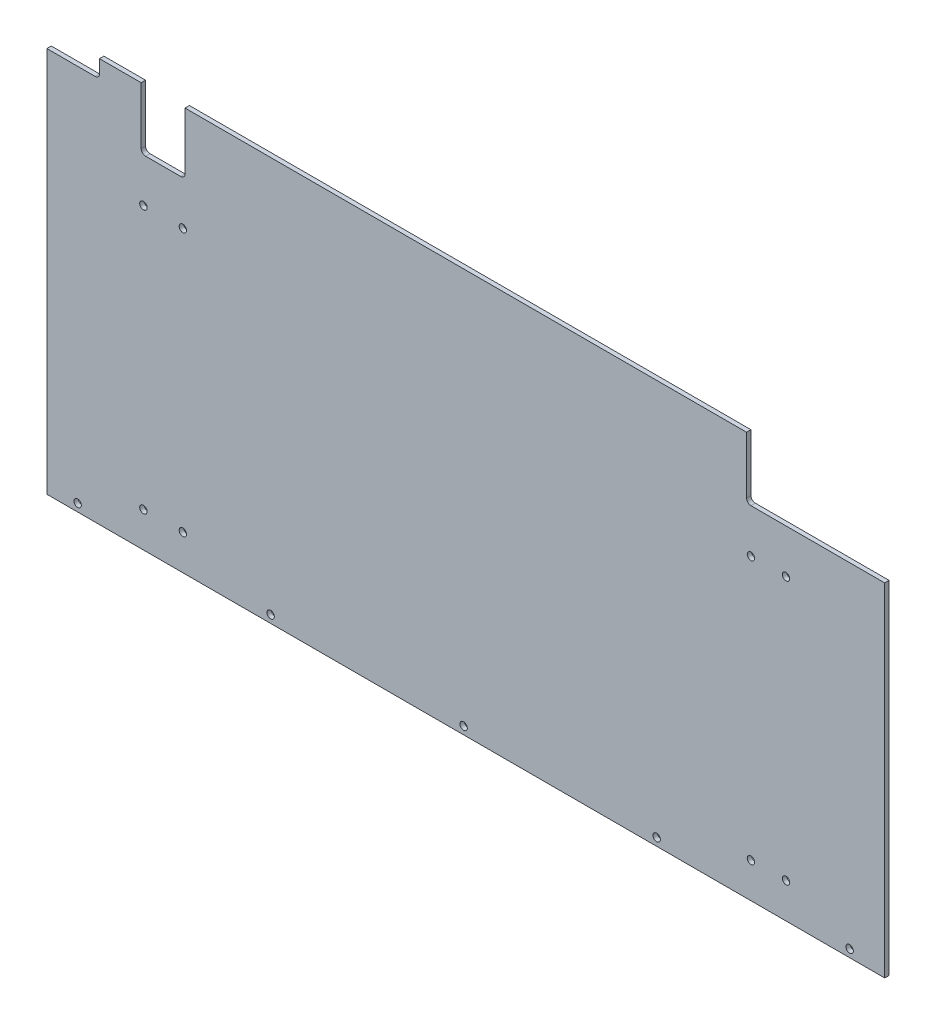
ISO-10303-21;
HEADER;
FILE_DESCRIPTION(('STEP AP214'),'2;1');
FILE_NAME('part.step','',(''),(''),'','','');
FILE_SCHEMA(('AUTOMOTIVE_DESIGN { 1 0 10303 214 1 1 1 1 }'));
ENDSEC;
DATA;
#1=APPLICATION_CONTEXT('core data for automotive mechanical design processes');
#2=APPLICATION_PROTOCOL_DEFINITION('international standard','automotive_design',2000,#1);
#3=PRODUCT_CONTEXT('',#1,'mechanical');
#4=PRODUCT('Part','Part','',(#3));
#5=PRODUCT_RELATED_PRODUCT_CATEGORY('part','',(#4));
#6=PRODUCT_DEFINITION_FORMATION('','',#4);
#7=PRODUCT_DEFINITION_CONTEXT('part definition',#1,'design');
#8=PRODUCT_DEFINITION('design','',#6,#7);
#9=PRODUCT_DEFINITION_SHAPE('','',#8);
#10=(LENGTH_UNIT() NAMED_UNIT(*) SI_UNIT(.MILLI.,.METRE.));
#11=(NAMED_UNIT(*) PLANE_ANGLE_UNIT() SI_UNIT($,.RADIAN.));
#12=(NAMED_UNIT(*) SI_UNIT($,.STERADIAN.) SOLID_ANGLE_UNIT());
#13=UNCERTAINTY_MEASURE_WITH_UNIT(LENGTH_MEASURE(1.E-05),#10,'distance_accuracy_value','');
#14=(GEOMETRIC_REPRESENTATION_CONTEXT(3) GLOBAL_UNCERTAINTY_ASSIGNED_CONTEXT((#13)) GLOBAL_UNIT_ASSIGNED_CONTEXT((#10,
#11,#12)) REPRESENTATION_CONTEXT('',''));
#15=CARTESIAN_POINT('',(0.,0.,0.));
#16=DIRECTION('',(0.,0.,1.));
#17=DIRECTION('',(1.,0.,0.));
#18=AXIS2_PLACEMENT_3D('',#15,#16,#17);
#19=CARTESIAN_POINT('',(-606.425,292.1,3.175));
#20=DIRECTION('',(0.,-1.,0.));
#21=DIRECTION('',(0.,0.,-1.));
#22=AXIS2_PLACEMENT_3D('',#19,#20,#21);
#23=PLANE('',#22);
#24=DIRECTION('',(0.,0.,1.));
#25=VECTOR('',#24,1.);
#26=CARTESIAN_POINT('',(-530.225,292.1,-3.175));
#27=LINE('',#26,#25);
#28=CARTESIAN_POINT('',(-530.225,292.1,-3.175));
#29=VERTEX_POINT('',#28);
#30=CARTESIAN_POINT('',(-530.225,292.1,3.175));
#31=VERTEX_POINT('',#30);
#32=EDGE_CURVE('E180',#29,#31,#27,.T.);
#33=ORIENTED_EDGE('',*,*,#32,.T.);
#34=DIRECTION('',(-1.,0.,0.));
#35=VECTOR('',#34,1.);
#36=CARTESIAN_POINT('',(-606.425,292.1,3.175));
#37=LINE('',#36,#35);
#38=CARTESIAN_POINT('',(-469.9,292.1,3.175));
#39=VERTEX_POINT('',#38);
#40=EDGE_CURVE('E281',#39,#31,#37,.T.);
#41=ORIENTED_EDGE('',*,*,#40,.F.);
#42=DIRECTION('',(0.,0.,1.));
#43=VECTOR('',#42,1.);
#44=CARTESIAN_POINT('',(-469.9,292.1,-3.175));
#45=LINE('',#44,#43);
#46=CARTESIAN_POINT('',(-469.9,292.1,-3.175));
#47=VERTEX_POINT('',#46);
#48=EDGE_CURVE('E221',#47,#39,#45,.T.);
#49=ORIENTED_EDGE('',*,*,#48,.F.);
#50=DIRECTION('',(-1.,0.,0.));
#51=VECTOR('',#50,1.);
#52=CARTESIAN_POINT('',(-606.425,292.1,-3.175));
#53=LINE('',#52,#51);
#54=EDGE_CURVE('E293',#47,#29,#53,.T.);
#55=ORIENTED_EDGE('',*,*,#54,.T.);
#56=EDGE_LOOP('',(#33,#41,#49,#55));
#57=FACE_BOUND('',#56,.T.);
#58=ADVANCED_FACE('F33',(#57),#23,.F.);
#59=CARTESIAN_POINT('',(555.625,-280.9875,3.175));
#60=DIRECTION('',(0.,0.,1.));
#61=DIRECTION('',(1.,0.,0.));
#62=AXIS2_PLACEMENT_3D('',#59,#60,#61);
#63=CYLINDRICAL_SURFACE('',#62,5.35787600000004);
#64=CARTESIAN_POINT('',(555.625,-280.9875,-3.175));
#65=DIRECTION('',(0.,0.,1.));
#66=DIRECTION('',(1.,0.,0.));
#67=AXIS2_PLACEMENT_3D('',#64,#65,#66);
#68=CIRCLE('',#67,5.35787600000004);
#69=CARTESIAN_POINT('',(560.982876,-280.9875,-3.175));
#70=VERTEX_POINT('',#69);
#71=EDGE_CURVE('E41',#70,#70,#68,.T.);
#72=ORIENTED_EDGE('',*,*,#71,.F.);
#73=EDGE_LOOP('',(#72));
#74=FACE_BOUND('',#73,.T.);
#75=CARTESIAN_POINT('',(555.625,-280.9875,3.175));
#76=DIRECTION('',(0.,0.,1.));
#77=DIRECTION('',(1.,0.,0.));
#78=AXIS2_PLACEMENT_3D('',#75,#76,#77);
#79=CIRCLE('',#78,5.35787600000004);
#80=CARTESIAN_POINT('',(560.982876,-280.9875,3.175));
#81=VERTEX_POINT('',#80);
#82=EDGE_CURVE('E11',#81,#81,#79,.T.);
#83=ORIENTED_EDGE('',*,*,#82,.T.);
#84=EDGE_LOOP('',(#83));
#85=FACE_BOUND('',#84,.T.);
#86=ADVANCED_FACE('F35',(#74,#85),#63,.F.);
#87=CARTESIAN_POINT('',(276.225,-280.9875,3.175));
#88=DIRECTION('',(0.,0.,1.));
#89=DIRECTION('',(1.,0.,0.));
#90=AXIS2_PLACEMENT_3D('',#87,#88,#89);
#91=CYLINDRICAL_SURFACE('',#90,5.35787600000004);
#92=CARTESIAN_POINT('',(276.225,-280.9875,-3.175));
#93=DIRECTION('',(0.,0.,1.));
#94=DIRECTION('',(1.,0.,0.));
#95=AXIS2_PLACEMENT_3D('',#92,#93,#94);
#96=CIRCLE('',#95,5.35787600000004);
#97=CARTESIAN_POINT('',(281.582876,-280.9875,-3.175));
#98=VERTEX_POINT('',#97);
#99=EDGE_CURVE('E336',#98,#98,#96,.T.);
#100=ORIENTED_EDGE('',*,*,#99,.F.);
#101=EDGE_LOOP('',(#100));
#102=FACE_BOUND('',#101,.T.);
#103=CARTESIAN_POINT('',(276.225,-280.9875,3.175));
#104=DIRECTION('',(0.,0.,1.));
#105=DIRECTION('',(1.,0.,0.));
#106=AXIS2_PLACEMENT_3D('',#103,#104,#105);
#107=CIRCLE('',#106,5.35787600000004);
#108=CARTESIAN_POINT('',(281.582876,-280.9875,3.175));
#109=VERTEX_POINT('',#108);
#110=EDGE_CURVE('E339',#109,#109,#107,.T.);
#111=ORIENTED_EDGE('',*,*,#110,.T.);
#112=EDGE_LOOP('',(#111));
#113=FACE_BOUND('',#112,.T.);
#114=ADVANCED_FACE('F347',(#102,#113),#91,.F.);
#115=CARTESIAN_POINT('',(-3.17500000000015,-280.9875,3.175));
#116=DIRECTION('',(0.,0.,1.));
#117=DIRECTION('',(1.,0.,0.));
#118=AXIS2_PLACEMENT_3D('',#115,#116,#117);
#119=CYLINDRICAL_SURFACE('',#118,5.35787600000004);
#120=CARTESIAN_POINT('',(-3.17500000000015,-280.9875,-3.175));
#121=DIRECTION('',(0.,0.,1.));
#122=DIRECTION('',(1.,0.,0.));
#123=AXIS2_PLACEMENT_3D('',#120,#121,#122);
#124=CIRCLE('',#123,5.35787600000004);
#125=CARTESIAN_POINT('',(2.18287599999989,-280.9875,-3.175));
#126=VERTEX_POINT('',#125);
#127=EDGE_CURVE('E330',#126,#126,#124,.T.);
#128=ORIENTED_EDGE('',*,*,#127,.F.);
#129=EDGE_LOOP('',(#128));
#130=FACE_BOUND('',#129,.T.);
#131=CARTESIAN_POINT('',(-3.17500000000015,-280.9875,3.175));
#132=DIRECTION('',(0.,0.,1.));
#133=DIRECTION('',(1.,0.,0.));
#134=AXIS2_PLACEMENT_3D('',#131,#132,#133);
#135=CIRCLE('',#134,5.35787600000004);
#136=CARTESIAN_POINT('',(2.18287599999989,-280.9875,3.175));
#137=VERTEX_POINT('',#136);
#138=EDGE_CURVE('E333',#137,#137,#135,.T.);
#139=ORIENTED_EDGE('',*,*,#138,.T.);
#140=EDGE_LOOP('',(#139));
#141=FACE_BOUND('',#140,.T.);
#142=ADVANCED_FACE('F377',(#130,#141),#119,.F.);
#143=CARTESIAN_POINT('',(406.4,292.1,-3.175));
#144=VERTEX_POINT('',#143);
#145=CARTESIAN_POINT('',(-406.4,292.1,-3.175));
#146=VERTEX_POINT('',#145);
#147=EDGE_CURVE('E296',#144,#146,#53,.T.);
#148=ORIENTED_EDGE('',*,*,#147,.T.);
#149=DIRECTION('',(0.,0.,1.));
#150=VECTOR('',#149,1.);
#151=CARTESIAN_POINT('',(-406.4,292.1,-3.175));
#152=LINE('',#151,#150);
#153=CARTESIAN_POINT('',(-406.4,292.1,3.175));
#154=VERTEX_POINT('',#153);
#155=EDGE_CURVE('E212',#146,#154,#152,.T.);
#156=ORIENTED_EDGE('',*,*,#155,.T.);
#157=CARTESIAN_POINT('',(406.4,292.1,3.175));
#158=VERTEX_POINT('',#157);
#159=EDGE_CURVE('E285',#158,#154,#37,.T.);
#160=ORIENTED_EDGE('',*,*,#159,.F.);
#161=DIRECTION('',(0.,0.,1.));
#162=VECTOR('',#161,1.);
#163=CARTESIAN_POINT('',(406.4,292.1,-3.175));
#164=LINE('',#163,#162);
#165=EDGE_CURVE('E272',#144,#158,#164,.T.);
#166=ORIENTED_EDGE('',*,*,#165,.F.);
#167=EDGE_LOOP('',(#148,#156,#160,#166));
#168=FACE_BOUND('',#167,.T.);
#169=ADVANCED_FACE('F370',(#168),#23,.F.);
#170=CARTESIAN_POINT('',(606.425,292.1,3.175));
#171=DIRECTION('',(-1.,0.,0.));
#172=DIRECTION('',(0.,0.,1.));
#173=AXIS2_PLACEMENT_3D('',#170,#171,#172);
#174=PLANE('',#173);
#175=DIRECTION('',(0.,1.,0.));
#176=VECTOR('',#175,1.);
#177=CARTESIAN_POINT('',(606.425,292.1,-3.175));
#178=LINE('',#177,#176);
#179=CARTESIAN_POINT('',(606.425,-292.1,-3.175));
#180=VERTEX_POINT('',#179);
#181=CARTESIAN_POINT('',(606.425,203.2,-3.175));
#182=VERTEX_POINT('',#181);
#183=EDGE_CURVE('E277',#180,#182,#178,.T.);
#184=ORIENTED_EDGE('',*,*,#183,.T.);
#185=DIRECTION('',(0.,0.,1.));
#186=VECTOR('',#185,1.);
#187=CARTESIAN_POINT('',(606.425,203.2,-3.175));
#188=LINE('',#187,#186);
#189=CARTESIAN_POINT('',(606.425,203.2,3.175));
#190=VERTEX_POINT('',#189);
#191=EDGE_CURVE('E195',#182,#190,#188,.T.);
#192=ORIENTED_EDGE('',*,*,#191,.T.);
#193=DIRECTION('',(0.,1.,0.));
#194=VECTOR('',#193,1.);
#195=CARTESIAN_POINT('',(606.425,292.1,3.175));
#196=LINE('',#195,#194);
#197=CARTESIAN_POINT('',(606.425,-292.1,3.175));
#198=VERTEX_POINT('',#197);
#199=EDGE_CURVE('E278',#198,#190,#196,.T.);
#200=ORIENTED_EDGE('',*,*,#199,.F.);
#201=DIRECTION('',(0.,0.,-1.));
#202=VECTOR('',#201,1.);
#203=CARTESIAN_POINT('',(606.425,-292.1,3.175));
#204=LINE('',#203,#202);
#205=EDGE_CURVE('E290',#198,#180,#204,.T.);
#206=ORIENTED_EDGE('',*,*,#205,.T.);
#207=EDGE_LOOP('',(#184,#192,#200,#206));
#208=FACE_BOUND('',#207,.T.);
#209=ADVANCED_FACE('F376',(#208),#174,.F.);
#210=CARTESIAN_POINT('',(-606.425,292.1,3.175));
#211=DIRECTION('',(1.,0.,0.));
#212=DIRECTION('',(0.,1.,0.));
#213=AXIS2_PLACEMENT_3D('',#210,#211,#212);
#214=PLANE('',#213);
#215=DIRECTION('',(0.,-1.,0.));
#216=VECTOR('',#215,1.);
#217=CARTESIAN_POINT('',(-606.425,292.1,3.175));
#218=LINE('',#217,#216);
#219=CARTESIAN_POINT('',(-606.425,266.7,3.175));
#220=VERTEX_POINT('',#219);
#221=CARTESIAN_POINT('',(-606.425,-292.1,3.175));
#222=VERTEX_POINT('',#221);
#223=EDGE_CURVE('E286',#220,#222,#218,.T.);
#224=ORIENTED_EDGE('',*,*,#223,.F.);
#225=DIRECTION('',(0.,0.,1.));
#226=VECTOR('',#225,1.);
#227=CARTESIAN_POINT('',(-606.425,266.7,-3.175));
#228=LINE('',#227,#226);
#229=CARTESIAN_POINT('',(-606.425,266.7,-3.175));
#230=VERTEX_POINT('',#229);
#231=EDGE_CURVE('E177',#230,#220,#228,.T.);
#232=ORIENTED_EDGE('',*,*,#231,.F.);
#233=DIRECTION('',(0.,-1.,0.));
#234=VECTOR('',#233,1.);
#235=CARTESIAN_POINT('',(-606.425,292.1,-3.175));
#236=LINE('',#235,#234);
#237=CARTESIAN_POINT('',(-606.425,-292.1,-3.175));
#238=VERTEX_POINT('',#237);
#239=EDGE_CURVE('E167',#230,#238,#236,.T.);
#240=ORIENTED_EDGE('',*,*,#239,.T.);
#241=DIRECTION('',(0.,0.,-1.));
#242=VECTOR('',#241,1.);
#243=CARTESIAN_POINT('',(-606.425,-292.1,3.175));
#244=LINE('',#243,#242);
#245=EDGE_CURVE('E301',#222,#238,#244,.T.);
#246=ORIENTED_EDGE('',*,*,#245,.F.);
#247=EDGE_LOOP('',(#224,#232,#240,#246));
#248=FACE_BOUND('',#247,.T.);
#249=ADVANCED_FACE('F362',(#248),#214,.F.);
#250=CARTESIAN_POINT('',(-606.425,-292.1,3.175));
#251=DIRECTION('',(0.,1.,0.));
#252=DIRECTION('',(0.,0.,1.));
#253=AXIS2_PLACEMENT_3D('',#250,#251,#252);
#254=PLANE('',#253);
#255=DIRECTION('',(1.,0.,0.));
#256=VECTOR('',#255,1.);
#257=CARTESIAN_POINT('',(-606.425,-292.1,-3.175));
#258=LINE('',#257,#256);
#259=EDGE_CURVE('E282',#238,#180,#258,.T.);
#260=ORIENTED_EDGE('',*,*,#259,.T.);
#261=ORIENTED_EDGE('',*,*,#205,.F.);
#262=DIRECTION('',(1.,0.,0.));
#263=VECTOR('',#262,1.);
#264=CARTESIAN_POINT('',(-606.425,-292.1,3.175));
#265=LINE('',#264,#263);
#266=EDGE_CURVE('E288',#222,#198,#265,.T.);
#267=ORIENTED_EDGE('',*,*,#266,.F.);
#268=ORIENTED_EDGE('',*,*,#245,.T.);
#269=EDGE_LOOP('',(#260,#261,#267,#268));
#270=FACE_BOUND('',#269,.T.);
#271=ADVANCED_FACE('F352',(#270),#254,.F.);
#272=CARTESIAN_POINT('',(0.,0.,3.175));
#273=DIRECTION('',(0.,0.,1.));
#274=DIRECTION('',(1.,0.,0.));
#275=AXIS2_PLACEMENT_3D('',#272,#273,#274);
#276=PLANE('',#275);
#277=DIRECTION('',(1.,0.,0.));
#278=VECTOR('',#277,1.);
#279=CARTESIAN_POINT('',(-2.1195166833753E-13,266.700000000001,3.175));
#280=LINE('',#279,#278);
#281=CARTESIAN_POINT('',(-536.575,266.7,3.175));
#282=VERTEX_POINT('',#281);
#283=EDGE_CURVE('E153',#220,#282,#280,.T.);
#284=ORIENTED_EDGE('',*,*,#283,.F.);
#285=ORIENTED_EDGE('',*,*,#223,.T.);
#286=ORIENTED_EDGE('',*,*,#266,.T.);
#287=ORIENTED_EDGE('',*,*,#199,.T.);
#288=DIRECTION('',(1.,0.,0.));
#289=VECTOR('',#288,1.);
#290=CARTESIAN_POINT('',(469.9,203.2,3.175));
#291=LINE('',#290,#289);
#292=CARTESIAN_POINT('',(412.75,203.2,3.175));
#293=VERTEX_POINT('',#292);
#294=EDGE_CURVE('E270',#293,#190,#291,.T.);
#295=ORIENTED_EDGE('',*,*,#294,.F.);
#296=CARTESIAN_POINT('',(412.75,209.55,3.175));
#297=DIRECTION('',(0.,0.,1.));
#298=DIRECTION('',(1.,0.,0.));
#299=AXIS2_PLACEMENT_3D('',#296,#297,#298);
#300=CIRCLE('',#299,6.35);
#301=CARTESIAN_POINT('',(406.4,209.55,3.175));
#302=VERTEX_POINT('',#301);
#303=EDGE_CURVE('E318',#293,#302,#300,.F.);
#304=ORIENTED_EDGE('',*,*,#303,.T.);
#305=DIRECTION('',(0.,-1.,0.));
#306=VECTOR('',#305,1.);
#307=CARTESIAN_POINT('',(406.4,292.1,3.175));
#308=LINE('',#307,#306);
#309=EDGE_CURVE('E245',#158,#302,#308,.T.);
#310=ORIENTED_EDGE('',*,*,#309,.F.);
#311=ORIENTED_EDGE('',*,*,#159,.T.);
#312=DIRECTION('',(0.,1.,0.));
#313=VECTOR('',#312,1.);
#314=CARTESIAN_POINT('',(-406.4,292.1,3.175));
#315=LINE('',#314,#313);
#316=CARTESIAN_POINT('',(-406.4,209.55,3.175));
#317=VERTEX_POINT('',#316);
#318=EDGE_CURVE('E216',#317,#154,#315,.T.);
#319=ORIENTED_EDGE('',*,*,#318,.F.);
#320=CARTESIAN_POINT('',(-412.75,209.55,3.175));
#321=DIRECTION('',(0.,0.,1.));
#322=DIRECTION('',(1.,0.,0.));
#323=AXIS2_PLACEMENT_3D('',#320,#321,#322);
#324=CIRCLE('',#323,6.35);
#325=CARTESIAN_POINT('',(-412.75,203.2,3.175));
#326=VERTEX_POINT('',#325);
#327=EDGE_CURVE('E322',#317,#326,#324,.F.);
#328=ORIENTED_EDGE('',*,*,#327,.T.);
#329=DIRECTION('',(1.,0.,0.));
#330=VECTOR('',#329,1.);
#331=CARTESIAN_POINT('',(-469.9,203.2,3.175));
#332=LINE('',#331,#330);
#333=CARTESIAN_POINT('',(-463.55,203.2,3.175));
#334=VERTEX_POINT('',#333);
#335=EDGE_CURVE('E223',#334,#326,#332,.T.);
#336=ORIENTED_EDGE('',*,*,#335,.F.);
#337=CARTESIAN_POINT('',(-463.55,209.55,3.175));
#338=DIRECTION('',(0.,0.,1.));
#339=DIRECTION('',(1.,0.,0.));
#340=AXIS2_PLACEMENT_3D('',#337,#338,#339);
#341=CIRCLE('',#340,6.35);
#342=CARTESIAN_POINT('',(-469.9,209.55,3.175));
#343=VERTEX_POINT('',#342);
#344=EDGE_CURVE('E326',#334,#343,#341,.F.);
#345=ORIENTED_EDGE('',*,*,#344,.T.);
#346=DIRECTION('',(0.,-1.,0.));
#347=VECTOR('',#346,1.);
#348=CARTESIAN_POINT('',(-469.9,292.1,3.175));
#349=LINE('',#348,#347);
#350=EDGE_CURVE('E202',#39,#343,#349,.T.);
#351=ORIENTED_EDGE('',*,*,#350,.F.);
#352=ORIENTED_EDGE('',*,*,#40,.T.);
#353=DIRECTION('',(0.,-1.,0.));
#354=VECTOR('',#353,1.);
#355=CARTESIAN_POINT('',(-530.225,0.,3.175));
#356=LINE('',#355,#354);
#357=CARTESIAN_POINT('',(-530.225,273.05,3.175));
#358=VERTEX_POINT('',#357);
#359=EDGE_CURVE('E168',#31,#358,#356,.T.);
#360=ORIENTED_EDGE('',*,*,#359,.T.);
#361=CARTESIAN_POINT('',(-536.575,273.05,3.175));
#362=DIRECTION('',(0.,0.,1.));
#363=DIRECTION('',(1.,0.,0.));
#364=AXIS2_PLACEMENT_3D('',#361,#362,#363);
#365=CIRCLE('',#364,6.34999999999997);
#366=EDGE_CURVE('E171',#282,#358,#365,.T.);
#367=ORIENTED_EDGE('',*,*,#366,.F.);
#368=EDGE_LOOP('',(#284,#285,#286,#287,#295,#304,#310,#311,#319,#328,#336,#345,#351,#352,#360,#367));
#369=FACE_BOUND('',#368,.T.);
#370=CARTESIAN_POINT('',(-282.575,-280.9875,3.175));
#371=DIRECTION('',(0.,0.,1.));
#372=DIRECTION('',(1.,0.,0.));
#373=AXIS2_PLACEMENT_3D('',#370,#371,#372);
#374=CIRCLE('',#373,5.35787600000004);
#375=CARTESIAN_POINT('',(-277.217124,-280.9875,3.175));
#376=VERTEX_POINT('',#375);
#377=EDGE_CURVE('E186',#376,#376,#374,.T.);
#378=ORIENTED_EDGE('',*,*,#377,.F.);
#379=EDGE_LOOP('',(#378));
#380=FACE_BOUND('',#379,.T.);
#381=CARTESIAN_POINT('',(-561.975,-280.9875,3.175));
#382=DIRECTION('',(0.,0.,1.));
#383=DIRECTION('',(1.,0.,0.));
#384=AXIS2_PLACEMENT_3D('',#381,#382,#383);
#385=CIRCLE('',#384,5.35787600000004);
#386=CARTESIAN_POINT('',(-556.617124,-280.9875,3.175));
#387=VERTEX_POINT('',#386);
#388=EDGE_CURVE('E189',#387,#387,#385,.T.);
#389=ORIENTED_EDGE('',*,*,#388,.F.);
#390=EDGE_LOOP('',(#389));
#391=FACE_BOUND('',#390,.T.);
#392=CARTESIAN_POINT('',(412.75,139.7,3.175));
#393=DIRECTION('',(0.,0.,1.));
#394=DIRECTION('',(1.,0.,0.));
#395=AXIS2_PLACEMENT_3D('',#392,#393,#394);
#396=CIRCLE('',#395,5.35781250000002);
#397=CARTESIAN_POINT('',(418.1078125,139.7,3.175));
#398=VERTEX_POINT('',#397);
#399=EDGE_CURVE('E234',#398,#398,#396,.T.);
#400=ORIENTED_EDGE('',*,*,#399,.F.);
#401=EDGE_LOOP('',(#400));
#402=FACE_BOUND('',#401,.T.);
#403=CARTESIAN_POINT('',(463.55,139.7,3.175));
#404=DIRECTION('',(0.,0.,1.));
#405=DIRECTION('',(1.,0.,0.));
#406=AXIS2_PLACEMENT_3D('',#403,#404,#405);
#407=CIRCLE('',#406,5.35781250000002);
#408=CARTESIAN_POINT('',(468.9078125,139.7,3.175));
#409=VERTEX_POINT('',#408);
#410=EDGE_CURVE('E208',#409,#409,#407,.T.);
#411=ORIENTED_EDGE('',*,*,#410,.F.);
#412=EDGE_LOOP('',(#411));
#413=FACE_BOUND('',#412,.T.);
#414=CARTESIAN_POINT('',(412.75,-241.3,3.175));
#415=DIRECTION('',(0.,0.,1.));
#416=DIRECTION('',(1.,0.,0.));
#417=AXIS2_PLACEMENT_3D('',#414,#415,#416);
#418=CIRCLE('',#417,5.35781250000002);
#419=CARTESIAN_POINT('',(418.1078125,-241.3,3.175));
#420=VERTEX_POINT('',#419);
#421=EDGE_CURVE('E209',#420,#420,#418,.T.);
#422=ORIENTED_EDGE('',*,*,#421,.F.);
#423=EDGE_LOOP('',(#422));
#424=FACE_BOUND('',#423,.T.);
#425=CARTESIAN_POINT('',(-409.575,-241.3,3.175));
#426=DIRECTION('',(0.,0.,1.));
#427=DIRECTION('',(1.,0.,0.));
#428=AXIS2_PLACEMENT_3D('',#425,#426,#427);
#429=CIRCLE('',#428,5.35781250000002);
#430=CARTESIAN_POINT('',(-404.2171875,-241.3,3.175));
#431=VERTEX_POINT('',#430);
#432=EDGE_CURVE('E233',#431,#431,#429,.T.);
#433=ORIENTED_EDGE('',*,*,#432,.F.);
#434=EDGE_LOOP('',(#433));
#435=FACE_BOUND('',#434,.T.);
#436=CARTESIAN_POINT('',(-466.725,-241.3,3.175));
#437=DIRECTION('',(0.,0.,1.));
#438=DIRECTION('',(1.,0.,0.));
#439=AXIS2_PLACEMENT_3D('',#436,#437,#438);
#440=CIRCLE('',#439,5.35781250000002);
#441=CARTESIAN_POINT('',(-461.3671875,-241.3,3.175));
#442=VERTEX_POINT('',#441);
#443=EDGE_CURVE('E258',#442,#442,#440,.T.);
#444=ORIENTED_EDGE('',*,*,#443,.F.);
#445=EDGE_LOOP('',(#444));
#446=FACE_BOUND('',#445,.T.);
#447=CARTESIAN_POINT('',(-409.575,139.7,3.175));
#448=DIRECTION('',(0.,0.,1.));
#449=DIRECTION('',(1.,0.,0.));
#450=AXIS2_PLACEMENT_3D('',#447,#448,#449);
#451=CIRCLE('',#450,5.35781250000002);
#452=CARTESIAN_POINT('',(-404.2171875,139.7,3.175));
#453=VERTEX_POINT('',#452);
#454=EDGE_CURVE('E252',#453,#453,#451,.T.);
#455=ORIENTED_EDGE('',*,*,#454,.F.);
#456=EDGE_LOOP('',(#455));
#457=FACE_BOUND('',#456,.T.);
#458=CARTESIAN_POINT('',(-466.725,139.7,3.175));
#459=DIRECTION('',(0.,0.,1.));
#460=DIRECTION('',(1.,0.,0.));
#461=AXIS2_PLACEMENT_3D('',#458,#459,#460);
#462=CIRCLE('',#461,5.35781250000002);
#463=CARTESIAN_POINT('',(-461.3671875,139.7,3.175));
#464=VERTEX_POINT('',#463);
#465=EDGE_CURVE('E246',#464,#464,#462,.T.);
#466=ORIENTED_EDGE('',*,*,#465,.F.);
#467=EDGE_LOOP('',(#466));
#468=FACE_BOUND('',#467,.T.);
#469=CARTESIAN_POINT('',(463.55,-241.3,3.175));
#470=DIRECTION('',(0.,0.,1.));
#471=DIRECTION('',(1.,0.,0.));
#472=AXIS2_PLACEMENT_3D('',#469,#470,#471);
#473=CIRCLE('',#472,5.35781250000002);
#474=CARTESIAN_POINT('',(468.9078125,-241.3,3.175));
#475=VERTEX_POINT('',#474);
#476=EDGE_CURVE('E198',#475,#475,#473,.T.);
#477=ORIENTED_EDGE('',*,*,#476,.F.);
#478=EDGE_LOOP('',(#477));
#479=FACE_BOUND('',#478,.T.);
#480=ORIENTED_EDGE('',*,*,#138,.F.);
#481=EDGE_LOOP('',(#480));
#482=FACE_BOUND('',#481,.T.);
#483=ORIENTED_EDGE('',*,*,#110,.F.);
#484=EDGE_LOOP('',(#483));
#485=FACE_BOUND('',#484,.T.);
#486=ORIENTED_EDGE('',*,*,#82,.F.);
#487=EDGE_LOOP('',(#486));
#488=FACE_BOUND('',#487,.T.);
#489=ADVANCED_FACE('F350',(#369,#380,#391,#402,#413,#424,#435,#446,#457,#468,#479,#482,#485,
#488),#276,.T.);
#490=CARTESIAN_POINT('',(0.,0.,-3.175));
#491=DIRECTION('',(0.,0.,1.));
#492=DIRECTION('',(1.,0.,0.));
#493=AXIS2_PLACEMENT_3D('',#490,#491,#492);
#494=PLANE('',#493);
#495=CARTESIAN_POINT('',(-282.575,-280.9875,-3.175));
#496=DIRECTION('',(0.,0.,1.));
#497=DIRECTION('',(1.,0.,0.));
#498=AXIS2_PLACEMENT_3D('',#495,#496,#497);
#499=CIRCLE('',#498,5.35787600000004);
#500=CARTESIAN_POINT('',(-277.217124,-280.9875,-3.175));
#501=VERTEX_POINT('',#500);
#502=EDGE_CURVE('E179',#501,#501,#499,.T.);
#503=ORIENTED_EDGE('',*,*,#502,.T.);
#504=EDGE_LOOP('',(#503));
#505=FACE_BOUND('',#504,.T.);
#506=CARTESIAN_POINT('',(-561.975,-280.9875,-3.175));
#507=DIRECTION('',(0.,0.,1.));
#508=DIRECTION('',(1.,0.,0.));
#509=AXIS2_PLACEMENT_3D('',#506,#507,#508);
#510=CIRCLE('',#509,5.35787600000004);
#511=CARTESIAN_POINT('',(-556.617124,-280.9875,-3.175));
#512=VERTEX_POINT('',#511);
#513=EDGE_CURVE('E192',#512,#512,#510,.T.);
#514=ORIENTED_EDGE('',*,*,#513,.T.);
#515=EDGE_LOOP('',(#514));
#516=FACE_BOUND('',#515,.T.);
#517=CARTESIAN_POINT('',(412.75,139.7,-3.175));
#518=DIRECTION('',(0.,0.,1.));
#519=DIRECTION('',(1.,0.,0.));
#520=AXIS2_PLACEMENT_3D('',#517,#518,#519);
#521=CIRCLE('',#520,5.35781250000002);
#522=CARTESIAN_POINT('',(418.1078125,139.7,-3.175));
#523=VERTEX_POINT('',#522);
#524=EDGE_CURVE('E230',#523,#523,#521,.T.);
#525=ORIENTED_EDGE('',*,*,#524,.T.);
#526=EDGE_LOOP('',(#525));
#527=FACE_BOUND('',#526,.T.);
#528=CARTESIAN_POINT('',(463.55,139.7,-3.175));
#529=DIRECTION('',(0.,0.,1.));
#530=DIRECTION('',(1.,0.,0.));
#531=AXIS2_PLACEMENT_3D('',#528,#529,#530);
#532=CIRCLE('',#531,5.35781250000002);
#533=CARTESIAN_POINT('',(468.9078125,139.7,-3.175));
#534=VERTEX_POINT('',#533);
#535=EDGE_CURVE('E237',#534,#534,#532,.T.);
#536=ORIENTED_EDGE('',*,*,#535,.T.);
#537=EDGE_LOOP('',(#536));
#538=FACE_BOUND('',#537,.T.);
#539=CARTESIAN_POINT('',(412.75,-241.3,-3.175));
#540=DIRECTION('',(0.,0.,1.));
#541=DIRECTION('',(1.,0.,0.));
#542=AXIS2_PLACEMENT_3D('',#539,#540,#541);
#543=CIRCLE('',#542,5.35781250000002);
#544=CARTESIAN_POINT('',(418.1078125,-241.3,-3.175));
#545=VERTEX_POINT('',#544);
#546=EDGE_CURVE('E205',#545,#545,#543,.T.);
#547=ORIENTED_EDGE('',*,*,#546,.T.);
#548=EDGE_LOOP('',(#547));
#549=FACE_BOUND('',#548,.T.);
#550=CARTESIAN_POINT('',(-409.575,-241.3,-3.175));
#551=DIRECTION('',(0.,0.,1.));
#552=DIRECTION('',(1.,0.,0.));
#553=AXIS2_PLACEMENT_3D('',#550,#551,#552);
#554=CIRCLE('',#553,5.35781250000002);
#555=CARTESIAN_POINT('',(-404.2171875,-241.3,-3.175));
#556=VERTEX_POINT('',#555);
#557=EDGE_CURVE('E261',#556,#556,#554,.T.);
#558=ORIENTED_EDGE('',*,*,#557,.T.);
#559=EDGE_LOOP('',(#558));
#560=FACE_BOUND('',#559,.T.);
#561=CARTESIAN_POINT('',(-466.725,-241.3,-3.175));
#562=DIRECTION('',(0.,0.,1.));
#563=DIRECTION('',(1.,0.,0.));
#564=AXIS2_PLACEMENT_3D('',#561,#562,#563);
#565=CIRCLE('',#564,5.35781250000002);
#566=CARTESIAN_POINT('',(-461.3671875,-241.3,-3.175));
#567=VERTEX_POINT('',#566);
#568=EDGE_CURVE('E255',#567,#567,#565,.T.);
#569=ORIENTED_EDGE('',*,*,#568,.T.);
#570=EDGE_LOOP('',(#569));
#571=FACE_BOUND('',#570,.T.);
#572=CARTESIAN_POINT('',(-409.575,139.7,-3.175));
#573=DIRECTION('',(0.,0.,1.));
#574=DIRECTION('',(1.,0.,0.));
#575=AXIS2_PLACEMENT_3D('',#572,#573,#574);
#576=CIRCLE('',#575,5.35781250000002);
#577=CARTESIAN_POINT('',(-404.2171875,139.7,-3.175));
#578=VERTEX_POINT('',#577);
#579=EDGE_CURVE('E249',#578,#578,#576,.T.);
#580=ORIENTED_EDGE('',*,*,#579,.T.);
#581=EDGE_LOOP('',(#580));
#582=FACE_BOUND('',#581,.T.);
#583=CARTESIAN_POINT('',(-466.725,139.7,-3.175));
#584=DIRECTION('',(0.,0.,1.));
#585=DIRECTION('',(1.,0.,0.));
#586=AXIS2_PLACEMENT_3D('',#583,#584,#585);
#587=CIRCLE('',#586,5.35781250000002);
#588=CARTESIAN_POINT('',(-461.3671875,139.7,-3.175));
#589=VERTEX_POINT('',#588);
#590=EDGE_CURVE('E242',#589,#589,#587,.T.);
#591=ORIENTED_EDGE('',*,*,#590,.T.);
#592=EDGE_LOOP('',(#591));
#593=FACE_BOUND('',#592,.T.);
#594=CARTESIAN_POINT('',(463.55,-241.3,-3.175));
#595=DIRECTION('',(0.,0.,1.));
#596=DIRECTION('',(1.,0.,0.));
#597=AXIS2_PLACEMENT_3D('',#594,#595,#596);
#598=CIRCLE('',#597,5.35781250000002);
#599=CARTESIAN_POINT('',(468.9078125,-241.3,-3.175));
#600=VERTEX_POINT('',#599);
#601=EDGE_CURVE('E199',#600,#600,#598,.T.);
#602=ORIENTED_EDGE('',*,*,#601,.T.);
#603=EDGE_LOOP('',(#602));
#604=FACE_BOUND('',#603,.T.);
#605=ORIENTED_EDGE('',*,*,#239,.F.);
#606=DIRECTION('',(1.,0.,0.));
#607=VECTOR('',#606,1.);
#608=CARTESIAN_POINT('',(-2.1195166833753E-13,266.700000000001,-3.175));
#609=LINE('',#608,#607);
#610=CARTESIAN_POINT('',(-536.575,266.7,-3.175));
#611=VERTEX_POINT('',#610);
#612=EDGE_CURVE('E150',#230,#611,#609,.T.);
#613=ORIENTED_EDGE('',*,*,#612,.T.);
#614=CARTESIAN_POINT('',(-536.575,273.05,-3.175));
#615=DIRECTION('',(0.,0.,1.));
#616=DIRECTION('',(1.,0.,0.));
#617=AXIS2_PLACEMENT_3D('',#614,#615,#616);
#618=CIRCLE('',#617,6.34999999999997);
#619=CARTESIAN_POINT('',(-530.225,273.05,-3.175));
#620=VERTEX_POINT('',#619);
#621=EDGE_CURVE('E158',#611,#620,#618,.T.);
#622=ORIENTED_EDGE('',*,*,#621,.T.);
#623=DIRECTION('',(0.,-1.,0.));
#624=VECTOR('',#623,1.);
#625=CARTESIAN_POINT('',(-530.225,0.,-3.175));
#626=LINE('',#625,#624);
#627=EDGE_CURVE('E155',#29,#620,#626,.T.);
#628=ORIENTED_EDGE('',*,*,#627,.F.);
#629=ORIENTED_EDGE('',*,*,#54,.F.);
#630=DIRECTION('',(0.,-1.,0.));
#631=VECTOR('',#630,1.);
#632=CARTESIAN_POINT('',(-469.9,292.1,-3.175));
#633=LINE('',#632,#631);
#634=CARTESIAN_POINT('',(-469.9,209.55,-3.175));
#635=VERTEX_POINT('',#634);
#636=EDGE_CURVE('E213',#47,#635,#633,.T.);
#637=ORIENTED_EDGE('',*,*,#636,.T.);
#638=CARTESIAN_POINT('',(-463.55,209.55,-3.175));
#639=DIRECTION('',(0.,0.,1.));
#640=DIRECTION('',(1.,0.,0.));
#641=AXIS2_PLACEMENT_3D('',#638,#639,#640);
#642=CIRCLE('',#641,6.35);
#643=CARTESIAN_POINT('',(-463.55,203.2,-3.175));
#644=VERTEX_POINT('',#643);
#645=EDGE_CURVE('E328',#635,#644,#642,.T.);
#646=ORIENTED_EDGE('',*,*,#645,.T.);
#647=DIRECTION('',(1.,0.,0.));
#648=VECTOR('',#647,1.);
#649=CARTESIAN_POINT('',(-469.9,203.2,-3.175));
#650=LINE('',#649,#648);
#651=CARTESIAN_POINT('',(-412.75,203.2,-3.175));
#652=VERTEX_POINT('',#651);
#653=EDGE_CURVE('E215',#644,#652,#650,.T.);
#654=ORIENTED_EDGE('',*,*,#653,.T.);
#655=CARTESIAN_POINT('',(-412.75,209.55,-3.175));
#656=DIRECTION('',(0.,0.,1.));
#657=DIRECTION('',(1.,0.,0.));
#658=AXIS2_PLACEMENT_3D('',#655,#656,#657);
#659=CIRCLE('',#658,6.35);
#660=CARTESIAN_POINT('',(-406.4,209.55,-3.175));
#661=VERTEX_POINT('',#660);
#662=EDGE_CURVE('E324',#652,#661,#659,.T.);
#663=ORIENTED_EDGE('',*,*,#662,.T.);
#664=DIRECTION('',(0.,1.,0.));
#665=VECTOR('',#664,1.);
#666=CARTESIAN_POINT('',(-406.4,292.1,-3.175));
#667=LINE('',#666,#665);
#668=EDGE_CURVE('E219',#661,#146,#667,.T.);
#669=ORIENTED_EDGE('',*,*,#668,.T.);
#670=ORIENTED_EDGE('',*,*,#147,.F.);
#671=DIRECTION('',(0.,-1.,0.));
#672=VECTOR('',#671,1.);
#673=CARTESIAN_POINT('',(406.4,292.1,-3.175));
#674=LINE('',#673,#672);
#675=CARTESIAN_POINT('',(406.4,209.55,-3.175));
#676=VERTEX_POINT('',#675);
#677=EDGE_CURVE('E266',#144,#676,#674,.T.);
#678=ORIENTED_EDGE('',*,*,#677,.T.);
#679=CARTESIAN_POINT('',(412.75,209.55,-3.175));
#680=DIRECTION('',(0.,0.,1.));
#681=DIRECTION('',(1.,0.,0.));
#682=AXIS2_PLACEMENT_3D('',#679,#680,#681);
#683=CIRCLE('',#682,6.35);
#684=CARTESIAN_POINT('',(412.75,203.2,-3.175));
#685=VERTEX_POINT('',#684);
#686=EDGE_CURVE('E320',#676,#685,#683,.T.);
#687=ORIENTED_EDGE('',*,*,#686,.T.);
#688=DIRECTION('',(1.,0.,0.));
#689=VECTOR('',#688,1.);
#690=CARTESIAN_POINT('',(469.9,203.2,-3.175));
#691=LINE('',#690,#689);
#692=EDGE_CURVE('E269',#685,#182,#691,.T.);
#693=ORIENTED_EDGE('',*,*,#692,.T.);
#694=ORIENTED_EDGE('',*,*,#183,.F.);
#695=ORIENTED_EDGE('',*,*,#259,.F.);
#696=EDGE_LOOP('',(#605,#613,#622,#628,#629,#637,#646,#654,#663,#669,#670,#678,#687,#693,#694,#695));
#697=FACE_BOUND('',#696,.T.);
#698=ORIENTED_EDGE('',*,*,#127,.T.);
#699=EDGE_LOOP('',(#698));
#700=FACE_BOUND('',#699,.T.);
#701=ORIENTED_EDGE('',*,*,#99,.T.);
#702=EDGE_LOOP('',(#701));
#703=FACE_BOUND('',#702,.T.);
#704=ORIENTED_EDGE('',*,*,#71,.T.);
#705=EDGE_LOOP('',(#704));
#706=FACE_BOUND('',#705,.T.);
#707=ADVANCED_FACE('F164',(#505,#516,#527,#538,#549,#560,#571,#582,#593,#604,#697,#700,#703,
#706),#494,.F.);
#708=CARTESIAN_POINT('',(469.9,203.2,-3.175));
#709=DIRECTION('',(0.,-1.,0.));
#710=DIRECTION('',(0.,0.,-1.));
#711=AXIS2_PLACEMENT_3D('',#708,#709,#710);
#712=PLANE('',#711);
#713=ORIENTED_EDGE('',*,*,#294,.T.);
#714=ORIENTED_EDGE('',*,*,#191,.F.);
#715=ORIENTED_EDGE('',*,*,#692,.F.);
#716=DIRECTION('',(0.,0.,1.));
#717=VECTOR('',#716,1.);
#718=CARTESIAN_POINT('',(412.75,203.2,3.175));
#719=LINE('',#718,#717);
#720=EDGE_CURVE('E304',#685,#293,#719,.T.);
#721=ORIENTED_EDGE('',*,*,#720,.T.);
#722=EDGE_LOOP('',(#713,#714,#715,#721));
#723=FACE_BOUND('',#722,.T.);
#724=ADVANCED_FACE('F359',(#723),#712,.F.);
#725=CARTESIAN_POINT('',(406.4,292.1,-3.175));
#726=DIRECTION('',(-1.,0.,0.));
#727=DIRECTION('',(0.,0.,1.));
#728=AXIS2_PLACEMENT_3D('',#725,#726,#727);
#729=PLANE('',#728);
#730=ORIENTED_EDGE('',*,*,#309,.T.);
#731=DIRECTION('',(0.,0.,1.));
#732=VECTOR('',#731,1.);
#733=CARTESIAN_POINT('',(406.4,209.55,-3.175));
#734=LINE('',#733,#732);
#735=EDGE_CURVE('E307',#302,#676,#734,.F.);
#736=ORIENTED_EDGE('',*,*,#735,.T.);
#737=ORIENTED_EDGE('',*,*,#677,.F.);
#738=ORIENTED_EDGE('',*,*,#165,.T.);
#739=EDGE_LOOP('',(#730,#736,#737,#738));
#740=FACE_BOUND('',#739,.T.);
#741=ADVANCED_FACE('F404',(#740),#729,.F.);
#742=CARTESIAN_POINT('',(463.55,-241.3,-3.175));
#743=DIRECTION('',(0.,0.,1.));
#744=DIRECTION('',(1.,0.,0.));
#745=AXIS2_PLACEMENT_3D('',#742,#743,#744);
#746=CYLINDRICAL_SURFACE('',#745,5.35781250000002);
#747=ORIENTED_EDGE('',*,*,#601,.F.);
#748=EDGE_LOOP('',(#747));
#749=FACE_BOUND('',#748,.T.);
#750=ORIENTED_EDGE('',*,*,#476,.T.);
#751=EDGE_LOOP('',(#750));
#752=FACE_BOUND('',#751,.T.);
#753=ADVANCED_FACE('F457',(#749,#752),#746,.F.);
#754=CARTESIAN_POINT('',(-466.725,139.7,-3.175));
#755=DIRECTION('',(0.,0.,1.));
#756=DIRECTION('',(1.,0.,0.));
#757=AXIS2_PLACEMENT_3D('',#754,#755,#756);
#758=CYLINDRICAL_SURFACE('',#757,5.35781250000002);
#759=ORIENTED_EDGE('',*,*,#590,.F.);
#760=EDGE_LOOP('',(#759));
#761=FACE_BOUND('',#760,.T.);
#762=ORIENTED_EDGE('',*,*,#465,.T.);
#763=EDGE_LOOP('',(#762));
#764=FACE_BOUND('',#763,.T.);
#765=ADVANCED_FACE('F453',(#761,#764),#758,.F.);
#766=CARTESIAN_POINT('',(-409.575,139.7,-3.175));
#767=DIRECTION('',(0.,0.,1.));
#768=DIRECTION('',(1.,0.,0.));
#769=AXIS2_PLACEMENT_3D('',#766,#767,#768);
#770=CYLINDRICAL_SURFACE('',#769,5.35781250000002);
#771=ORIENTED_EDGE('',*,*,#579,.F.);
#772=EDGE_LOOP('',(#771));
#773=FACE_BOUND('',#772,.T.);
#774=ORIENTED_EDGE('',*,*,#454,.T.);
#775=EDGE_LOOP('',(#774));
#776=FACE_BOUND('',#775,.T.);
#777=ADVANCED_FACE('F456',(#773,#776),#770,.F.);
#778=CARTESIAN_POINT('',(-466.725,-241.3,-3.175));
#779=DIRECTION('',(0.,0.,1.));
#780=DIRECTION('',(1.,0.,0.));
#781=AXIS2_PLACEMENT_3D('',#778,#779,#780);
#782=CYLINDRICAL_SURFACE('',#781,5.35781250000002);
#783=ORIENTED_EDGE('',*,*,#568,.F.);
#784=EDGE_LOOP('',(#783));
#785=FACE_BOUND('',#784,.T.);
#786=ORIENTED_EDGE('',*,*,#443,.T.);
#787=EDGE_LOOP('',(#786));
#788=FACE_BOUND('',#787,.T.);
#789=ADVANCED_FACE('F461',(#785,#788),#782,.F.);
#790=CARTESIAN_POINT('',(-409.575,-241.3,-3.175));
#791=DIRECTION('',(0.,0.,1.));
#792=DIRECTION('',(1.,0.,0.));
#793=AXIS2_PLACEMENT_3D('',#790,#791,#792);
#794=CYLINDRICAL_SURFACE('',#793,5.35781250000002);
#795=ORIENTED_EDGE('',*,*,#557,.F.);
#796=EDGE_LOOP('',(#795));
#797=FACE_BOUND('',#796,.T.);
#798=ORIENTED_EDGE('',*,*,#432,.T.);
#799=EDGE_LOOP('',(#798));
#800=FACE_BOUND('',#799,.T.);
#801=ADVANCED_FACE('F465',(#797,#800),#794,.F.);
#802=CARTESIAN_POINT('',(-406.4,292.1,-3.175));
#803=DIRECTION('',(1.,0.,0.));
#804=DIRECTION('',(0.,0.,-1.));
#805=AXIS2_PLACEMENT_3D('',#802,#803,#804);
#806=PLANE('',#805);
#807=ORIENTED_EDGE('',*,*,#668,.F.);
#808=DIRECTION('',(0.,0.,1.));
#809=VECTOR('',#808,1.);
#810=CARTESIAN_POINT('',(-406.4,209.55,3.175));
#811=LINE('',#810,#809);
#812=EDGE_CURVE('E309',#661,#317,#811,.T.);
#813=ORIENTED_EDGE('',*,*,#812,.T.);
#814=ORIENTED_EDGE('',*,*,#318,.T.);
#815=ORIENTED_EDGE('',*,*,#155,.F.);
#816=EDGE_LOOP('',(#807,#813,#814,#815));
#817=FACE_BOUND('',#816,.T.);
#818=ADVANCED_FACE('F397',(#817),#806,.F.);
#819=CARTESIAN_POINT('',(-469.9,203.2,-3.175));
#820=DIRECTION('',(0.,-1.,0.));
#821=DIRECTION('',(0.,0.,-1.));
#822=AXIS2_PLACEMENT_3D('',#819,#820,#821);
#823=PLANE('',#822);
#824=ORIENTED_EDGE('',*,*,#335,.T.);
#825=DIRECTION('',(0.,0.,1.));
#826=VECTOR('',#825,1.);
#827=CARTESIAN_POINT('',(-412.75,203.2,-3.175));
#828=LINE('',#827,#826);
#829=EDGE_CURVE('E315',#326,#652,#828,.F.);
#830=ORIENTED_EDGE('',*,*,#829,.T.);
#831=ORIENTED_EDGE('',*,*,#653,.F.);
#832=DIRECTION('',(0.,0.,1.));
#833=VECTOR('',#832,1.);
#834=CARTESIAN_POINT('',(-463.55,203.2,3.175));
#835=LINE('',#834,#833);
#836=EDGE_CURVE('E312',#644,#334,#835,.T.);
#837=ORIENTED_EDGE('',*,*,#836,.T.);
#838=EDGE_LOOP('',(#824,#830,#831,#837));
#839=FACE_BOUND('',#838,.T.);
#840=ADVANCED_FACE('F430',(#839),#823,.F.);
#841=CARTESIAN_POINT('',(-469.9,292.1,-3.175));
#842=DIRECTION('',(-1.,0.,0.));
#843=DIRECTION('',(0.,0.,1.));
#844=AXIS2_PLACEMENT_3D('',#841,#842,#843);
#845=PLANE('',#844);
#846=ORIENTED_EDGE('',*,*,#350,.T.);
#847=DIRECTION('',(0.,0.,1.));
#848=VECTOR('',#847,1.);
#849=CARTESIAN_POINT('',(-469.9,209.55,-3.175));
#850=LINE('',#849,#848);
#851=EDGE_CURVE('E56',#343,#635,#850,.F.);
#852=ORIENTED_EDGE('',*,*,#851,.T.);
#853=ORIENTED_EDGE('',*,*,#636,.F.);
#854=ORIENTED_EDGE('',*,*,#48,.T.);
#855=EDGE_LOOP('',(#846,#852,#853,#854));
#856=FACE_BOUND('',#855,.T.);
#857=ADVANCED_FACE('F432',(#856),#845,.F.);
#858=CARTESIAN_POINT('',(412.75,-241.3,-3.175));
#859=DIRECTION('',(0.,0.,1.));
#860=DIRECTION('',(1.,0.,0.));
#861=AXIS2_PLACEMENT_3D('',#858,#859,#860);
#862=CYLINDRICAL_SURFACE('',#861,5.35781250000002);
#863=ORIENTED_EDGE('',*,*,#546,.F.);
#864=EDGE_LOOP('',(#863));
#865=FACE_BOUND('',#864,.T.);
#866=ORIENTED_EDGE('',*,*,#421,.T.);
#867=EDGE_LOOP('',(#866));
#868=FACE_BOUND('',#867,.T.);
#869=ADVANCED_FACE('F434',(#865,#868),#862,.F.);
#870=CARTESIAN_POINT('',(463.55,139.7,-3.175));
#871=DIRECTION('',(0.,0.,1.));
#872=DIRECTION('',(1.,0.,0.));
#873=AXIS2_PLACEMENT_3D('',#870,#871,#872);
#874=CYLINDRICAL_SURFACE('',#873,5.35781250000002);
#875=ORIENTED_EDGE('',*,*,#535,.F.);
#876=EDGE_LOOP('',(#875));
#877=FACE_BOUND('',#876,.T.);
#878=ORIENTED_EDGE('',*,*,#410,.T.);
#879=EDGE_LOOP('',(#878));
#880=FACE_BOUND('',#879,.T.);
#881=ADVANCED_FACE('F440',(#877,#880),#874,.F.);
#882=CARTESIAN_POINT('',(412.75,139.7,-3.175));
#883=DIRECTION('',(0.,0.,1.));
#884=DIRECTION('',(1.,0.,0.));
#885=AXIS2_PLACEMENT_3D('',#882,#883,#884);
#886=CYLINDRICAL_SURFACE('',#885,5.35781250000002);
#887=ORIENTED_EDGE('',*,*,#524,.F.);
#888=EDGE_LOOP('',(#887));
#889=FACE_BOUND('',#888,.T.);
#890=ORIENTED_EDGE('',*,*,#399,.T.);
#891=EDGE_LOOP('',(#890));
#892=FACE_BOUND('',#891,.T.);
#893=ADVANCED_FACE('F446',(#889,#892),#886,.F.);
#894=CARTESIAN_POINT('',(412.75,209.55,-3.175));
#895=DIRECTION('',(0.,0.,-1.));
#896=DIRECTION('',(-1.,0.,0.));
#897=AXIS2_PLACEMENT_3D('',#894,#895,#896);
#898=CYLINDRICAL_SURFACE('',#897,6.35);
#899=ORIENTED_EDGE('',*,*,#686,.F.);
#900=ORIENTED_EDGE('',*,*,#735,.F.);
#901=ORIENTED_EDGE('',*,*,#303,.F.);
#902=ORIENTED_EDGE('',*,*,#720,.F.);
#903=EDGE_LOOP('',(#899,#900,#901,#902));
#904=FACE_BOUND('',#903,.T.);
#905=ADVANCED_FACE('F406',(#904),#898,.F.);
#906=CARTESIAN_POINT('',(-412.75,209.55,-3.175));
#907=DIRECTION('',(0.,0.,-1.));
#908=DIRECTION('',(-1.,0.,0.));
#909=AXIS2_PLACEMENT_3D('',#906,#907,#908);
#910=CYLINDRICAL_SURFACE('',#909,6.35);
#911=ORIENTED_EDGE('',*,*,#662,.F.);
#912=ORIENTED_EDGE('',*,*,#829,.F.);
#913=ORIENTED_EDGE('',*,*,#327,.F.);
#914=ORIENTED_EDGE('',*,*,#812,.F.);
#915=EDGE_LOOP('',(#911,#912,#913,#914));
#916=FACE_BOUND('',#915,.T.);
#917=ADVANCED_FACE('F507',(#916),#910,.F.);
#918=CARTESIAN_POINT('',(-463.55,209.55,-3.175));
#919=DIRECTION('',(0.,0.,-1.));
#920=DIRECTION('',(-1.,0.,0.));
#921=AXIS2_PLACEMENT_3D('',#918,#919,#920);
#922=CYLINDRICAL_SURFACE('',#921,6.35);
#923=ORIENTED_EDGE('',*,*,#645,.F.);
#924=ORIENTED_EDGE('',*,*,#851,.F.);
#925=ORIENTED_EDGE('',*,*,#344,.F.);
#926=ORIENTED_EDGE('',*,*,#836,.F.);
#927=EDGE_LOOP('',(#923,#924,#925,#926));
#928=FACE_BOUND('',#927,.T.);
#929=ADVANCED_FACE('F428',(#928),#922,.F.);
#930=CARTESIAN_POINT('',(-561.975,-280.9875,3.175));
#931=DIRECTION('',(0.,0.,1.));
#932=DIRECTION('',(1.,0.,0.));
#933=AXIS2_PLACEMENT_3D('',#930,#931,#932);
#934=CYLINDRICAL_SURFACE('',#933,5.35787600000004);
#935=ORIENTED_EDGE('',*,*,#513,.F.);
#936=EDGE_LOOP('',(#935));
#937=FACE_BOUND('',#936,.T.);
#938=ORIENTED_EDGE('',*,*,#388,.T.);
#939=EDGE_LOOP('',(#938));
#940=FACE_BOUND('',#939,.T.);
#941=ADVANCED_FACE('F482',(#937,#940),#934,.F.);
#942=CARTESIAN_POINT('',(-282.575,-280.9875,3.175));
#943=DIRECTION('',(0.,0.,1.));
#944=DIRECTION('',(1.,0.,0.));
#945=AXIS2_PLACEMENT_3D('',#942,#943,#944);
#946=CYLINDRICAL_SURFACE('',#945,5.35787600000004);
#947=ORIENTED_EDGE('',*,*,#502,.F.);
#948=EDGE_LOOP('',(#947));
#949=FACE_BOUND('',#948,.T.);
#950=ORIENTED_EDGE('',*,*,#377,.T.);
#951=EDGE_LOOP('',(#950));
#952=FACE_BOUND('',#951,.T.);
#953=ADVANCED_FACE('F549',(#949,#952),#946,.F.);
#954=CARTESIAN_POINT('',(-2.1195166833753E-13,266.700000000001,-3.175));
#955=DIRECTION('',(0.,-1.,0.));
#956=DIRECTION('',(1.,0.,0.));
#957=AXIS2_PLACEMENT_3D('',#954,#955,#956);
#958=PLANE('',#957);
#959=ORIENTED_EDGE('',*,*,#283,.T.);
#960=DIRECTION('',(0.,0.,1.));
#961=VECTOR('',#960,1.);
#962=CARTESIAN_POINT('',(-536.575,266.7,-3.175));
#963=LINE('',#962,#961);
#964=EDGE_CURVE('E147',#611,#282,#963,.T.);
#965=ORIENTED_EDGE('',*,*,#964,.F.);
#966=ORIENTED_EDGE('',*,*,#612,.F.);
#967=ORIENTED_EDGE('',*,*,#231,.T.);
#968=EDGE_LOOP('',(#959,#965,#966,#967));
#969=FACE_BOUND('',#968,.T.);
#970=ADVANCED_FACE('F148',(#969),#958,.F.);
#971=CARTESIAN_POINT('',(-530.225,0.,-3.175));
#972=DIRECTION('',(-1.,0.,0.));
#973=DIRECTION('',(0.,0.,1.));
#974=AXIS2_PLACEMENT_3D('',#971,#972,#973);
#975=PLANE('',#974);
#976=ORIENTED_EDGE('',*,*,#359,.F.);
#977=ORIENTED_EDGE('',*,*,#32,.F.);
#978=ORIENTED_EDGE('',*,*,#627,.T.);
#979=DIRECTION('',(0.,0.,1.));
#980=VECTOR('',#979,1.);
#981=CARTESIAN_POINT('',(-530.225,273.05,-3.175));
#982=LINE('',#981,#980);
#983=EDGE_CURVE('E48',#620,#358,#982,.T.);
#984=ORIENTED_EDGE('',*,*,#983,.T.);
#985=EDGE_LOOP('',(#976,#977,#978,#984));
#986=FACE_BOUND('',#985,.T.);
#987=ADVANCED_FACE('F421',(#986),#975,.T.);
#988=CARTESIAN_POINT('',(-536.575,273.05,-3.175));
#989=DIRECTION('',(0.,0.,1.));
#990=DIRECTION('',(1.,0.,0.));
#991=AXIS2_PLACEMENT_3D('',#988,#989,#990);
#992=CYLINDRICAL_SURFACE('',#991,6.34999999999997);
#993=ORIENTED_EDGE('',*,*,#366,.T.);
#994=ORIENTED_EDGE('',*,*,#983,.F.);
#995=ORIENTED_EDGE('',*,*,#621,.F.);
#996=ORIENTED_EDGE('',*,*,#964,.T.);
#997=EDGE_LOOP('',(#993,#994,#995,#996));
#998=FACE_BOUND('',#997,.T.);
#999=ADVANCED_FACE('F159',(#998),#992,.F.);
#1000=CLOSED_SHELL('',(#58,#86,#114,#142,#169,#209,#249,#271,#489,#707,#724,#741,#753,#765,#777,
#789,#801,#818,#840,#857,#869,#881,#893,#905,#917,#929,#941,#953,#970,#987,#999));
#1001=MANIFOLD_SOLID_BREP('B2',#1000);
#1002=ADVANCED_BREP_SHAPE_REPRESENTATION('',(#18,#1001),#14);
#1003=SHAPE_DEFINITION_REPRESENTATION(#9,#1002);
ENDSEC;
END-ISO-10303-21;
